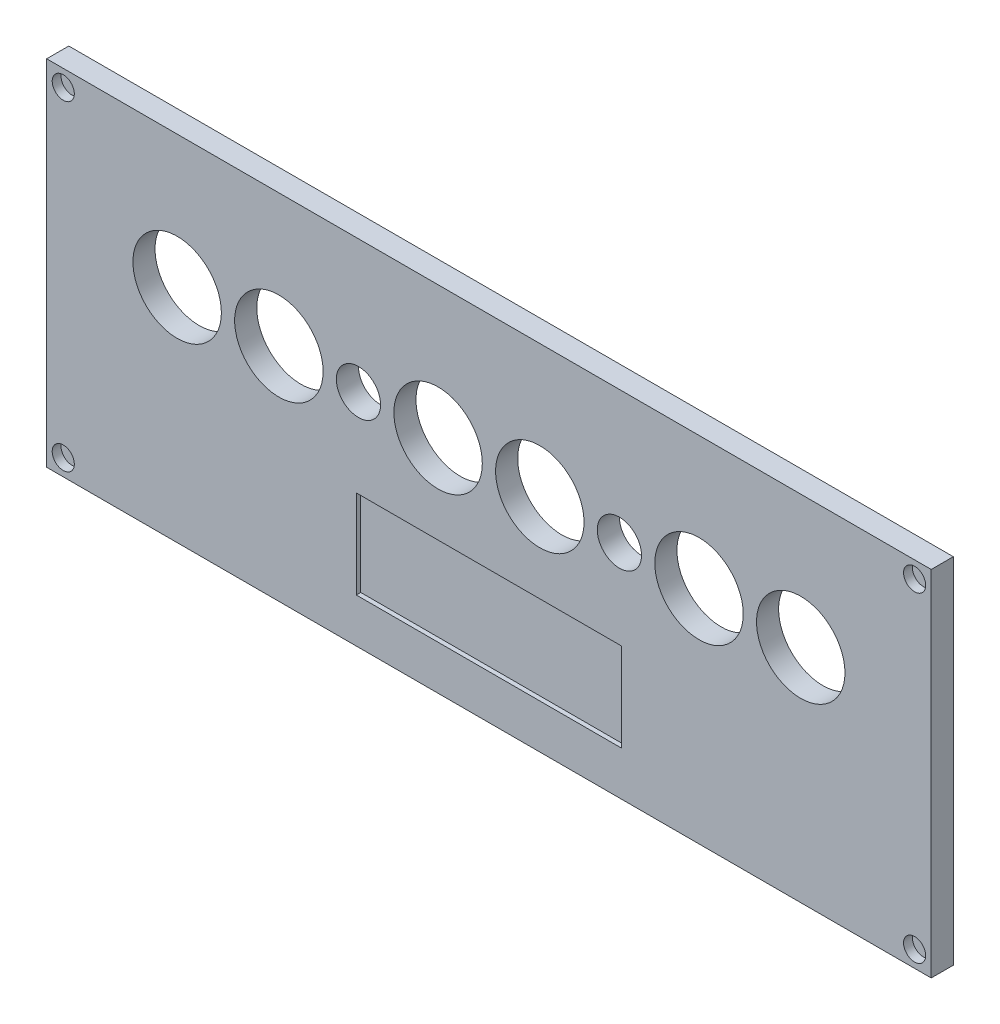
ISO-10303-21;
HEADER;
FILE_DESCRIPTION(('STEP AP214'),'2;1');
FILE_NAME('part.step','',(''),(''),'','','');
FILE_SCHEMA(('AUTOMOTIVE_DESIGN { 1 0 10303 214 1 1 1 1 }'));
ENDSEC;
DATA;
#1=APPLICATION_CONTEXT('core data for automotive mechanical design processes');
#2=APPLICATION_PROTOCOL_DEFINITION('international standard','automotive_design',2000,#1);
#3=PRODUCT_CONTEXT('',#1,'mechanical');
#4=PRODUCT('Part','Part','',(#3));
#5=PRODUCT_RELATED_PRODUCT_CATEGORY('part','',(#4));
#6=PRODUCT_DEFINITION_FORMATION('','',#4);
#7=PRODUCT_DEFINITION_CONTEXT('part definition',#1,'design');
#8=PRODUCT_DEFINITION('design','',#6,#7);
#9=PRODUCT_DEFINITION_SHAPE('','',#8);
#10=(LENGTH_UNIT() NAMED_UNIT(*) SI_UNIT(.MILLI.,.METRE.));
#11=(NAMED_UNIT(*) PLANE_ANGLE_UNIT() SI_UNIT($,.RADIAN.));
#12=(NAMED_UNIT(*) SI_UNIT($,.STERADIAN.) SOLID_ANGLE_UNIT());
#13=UNCERTAINTY_MEASURE_WITH_UNIT(LENGTH_MEASURE(1.E-05),#10,'distance_accuracy_value','');
#14=(GEOMETRIC_REPRESENTATION_CONTEXT(3) GLOBAL_UNCERTAINTY_ASSIGNED_CONTEXT((#13)) GLOBAL_UNIT_ASSIGNED_CONTEXT((#10,
#11,#12)) REPRESENTATION_CONTEXT('',''));
#15=CARTESIAN_POINT('',(0.,0.,0.));
#16=DIRECTION('',(0.,0.,1.));
#17=DIRECTION('',(1.,0.,0.));
#18=AXIS2_PLACEMENT_3D('',#15,#16,#17);
#19=CARTESIAN_POINT('',(100.,-40.,5.));
#20=DIRECTION('',(-1.,0.,0.));
#21=DIRECTION('',(0.,0.,1.));
#22=AXIS2_PLACEMENT_3D('',#19,#20,#21);
#23=PLANE('',#22);
#24=DIRECTION('',(0.,1.,0.));
#25=VECTOR('',#24,1.);
#26=CARTESIAN_POINT('',(100.,-40.,0.));
#27=LINE('',#26,#25);
#28=CARTESIAN_POINT('',(100.,-40.,0.));
#29=VERTEX_POINT('',#28);
#30=CARTESIAN_POINT('',(100.,40.,0.));
#31=VERTEX_POINT('',#30);
#32=EDGE_CURVE('E170',#29,#31,#27,.T.);
#33=ORIENTED_EDGE('',*,*,#32,.T.);
#34=DIRECTION('',(0.,0.,-1.));
#35=VECTOR('',#34,1.);
#36=CARTESIAN_POINT('',(100.,40.,5.));
#37=LINE('',#36,#35);
#38=CARTESIAN_POINT('',(100.,40.,5.));
#39=VERTEX_POINT('',#38);
#40=EDGE_CURVE('E11',#39,#31,#37,.T.);
#41=ORIENTED_EDGE('',*,*,#40,.F.);
#42=DIRECTION('',(0.,1.,0.));
#43=VECTOR('',#42,1.);
#44=CARTESIAN_POINT('',(100.,-40.,5.));
#45=LINE('',#44,#43);
#46=CARTESIAN_POINT('',(100.,-40.,5.));
#47=VERTEX_POINT('',#46);
#48=EDGE_CURVE('E173',#47,#39,#45,.T.);
#49=ORIENTED_EDGE('',*,*,#48,.F.);
#50=DIRECTION('',(0.,0.,-1.));
#51=VECTOR('',#50,1.);
#52=CARTESIAN_POINT('',(100.,-40.,5.));
#53=LINE('',#52,#51);
#54=EDGE_CURVE('E179',#47,#29,#53,.T.);
#55=ORIENTED_EDGE('',*,*,#54,.T.);
#56=EDGE_LOOP('',(#33,#41,#49,#55));
#57=FACE_BOUND('',#56,.T.);
#58=ADVANCED_FACE('F33',(#57),#23,.F.);
#59=CARTESIAN_POINT('',(-100.,40.,5.));
#60=DIRECTION('',(0.,-1.,0.));
#61=DIRECTION('',(0.,0.,-1.));
#62=AXIS2_PLACEMENT_3D('',#59,#60,#61);
#63=PLANE('',#62);
#64=DIRECTION('',(-1.,0.,0.));
#65=VECTOR('',#64,1.);
#66=CARTESIAN_POINT('',(-100.,40.,0.));
#67=LINE('',#66,#65);
#68=CARTESIAN_POINT('',(-100.,40.,0.));
#69=VERTEX_POINT('',#68);
#70=EDGE_CURVE('E182',#31,#69,#67,.T.);
#71=ORIENTED_EDGE('',*,*,#70,.T.);
#72=DIRECTION('',(0.,0.,-1.));
#73=VECTOR('',#72,1.);
#74=CARTESIAN_POINT('',(-100.,40.,5.));
#75=LINE('',#74,#73);
#76=CARTESIAN_POINT('',(-100.,40.,5.));
#77=VERTEX_POINT('',#76);
#78=EDGE_CURVE('E40',#77,#69,#75,.T.);
#79=ORIENTED_EDGE('',*,*,#78,.F.);
#80=DIRECTION('',(-1.,0.,0.));
#81=VECTOR('',#80,1.);
#82=CARTESIAN_POINT('',(-100.,40.,5.));
#83=LINE('',#82,#81);
#84=EDGE_CURVE('E84',#39,#77,#83,.T.);
#85=ORIENTED_EDGE('',*,*,#84,.F.);
#86=ORIENTED_EDGE('',*,*,#40,.T.);
#87=EDGE_LOOP('',(#71,#79,#85,#86));
#88=FACE_BOUND('',#87,.T.);
#89=ADVANCED_FACE('F211',(#88),#63,.F.);
#90=CARTESIAN_POINT('',(-100.,-40.,5.));
#91=DIRECTION('',(1.,0.,0.));
#92=DIRECTION('',(0.,0.,-1.));
#93=AXIS2_PLACEMENT_3D('',#90,#91,#92);
#94=PLANE('',#93);
#95=DIRECTION('',(0.,-1.,0.));
#96=VECTOR('',#95,1.);
#97=CARTESIAN_POINT('',(-100.,-40.,0.));
#98=LINE('',#97,#96);
#99=CARTESIAN_POINT('',(-100.,-40.,0.));
#100=VERTEX_POINT('',#99);
#101=EDGE_CURVE('E184',#69,#100,#98,.T.);
#102=ORIENTED_EDGE('',*,*,#101,.T.);
#103=DIRECTION('',(0.,0.,-1.));
#104=VECTOR('',#103,1.);
#105=CARTESIAN_POINT('',(-100.,-40.,5.));
#106=LINE('',#105,#104);
#107=CARTESIAN_POINT('',(-100.,-40.,5.));
#108=VERTEX_POINT('',#107);
#109=EDGE_CURVE('E188',#108,#100,#106,.T.);
#110=ORIENTED_EDGE('',*,*,#109,.F.);
#111=DIRECTION('',(0.,-1.,0.));
#112=VECTOR('',#111,1.);
#113=CARTESIAN_POINT('',(-100.,-40.,5.));
#114=LINE('',#113,#112);
#115=EDGE_CURVE('E176',#77,#108,#114,.T.);
#116=ORIENTED_EDGE('',*,*,#115,.F.);
#117=ORIENTED_EDGE('',*,*,#78,.T.);
#118=EDGE_LOOP('',(#102,#110,#116,#117));
#119=FACE_BOUND('',#118,.T.);
#120=ADVANCED_FACE('F193',(#119),#94,.F.);
#121=CARTESIAN_POINT('',(-100.,-40.,5.));
#122=DIRECTION('',(0.,1.,0.));
#123=DIRECTION('',(0.,0.,1.));
#124=AXIS2_PLACEMENT_3D('',#121,#122,#123);
#125=PLANE('',#124);
#126=DIRECTION('',(1.,0.,0.));
#127=VECTOR('',#126,1.);
#128=CARTESIAN_POINT('',(-100.,-40.,0.));
#129=LINE('',#128,#127);
#130=EDGE_CURVE('E77',#100,#29,#129,.T.);
#131=ORIENTED_EDGE('',*,*,#130,.T.);
#132=ORIENTED_EDGE('',*,*,#54,.F.);
#133=DIRECTION('',(1.,0.,0.));
#134=VECTOR('',#133,1.);
#135=CARTESIAN_POINT('',(-100.,-40.,5.));
#136=LINE('',#135,#134);
#137=EDGE_CURVE('E56',#108,#47,#136,.T.);
#138=ORIENTED_EDGE('',*,*,#137,.F.);
#139=ORIENTED_EDGE('',*,*,#109,.T.);
#140=EDGE_LOOP('',(#131,#132,#138,#139));
#141=FACE_BOUND('',#140,.T.);
#142=ADVANCED_FACE('F201',(#141),#125,.F.);
#143=CARTESIAN_POINT('',(0.,0.,5.));
#144=DIRECTION('',(0.,0.,-1.));
#145=DIRECTION('',(-1.,0.,0.));
#146=AXIS2_PLACEMENT_3D('',#143,#144,#145);
#147=PLANE('',#146);
#148=CARTESIAN_POINT('',(70.5,10.,5.));
#149=DIRECTION('',(0.,0.,1.));
#150=DIRECTION('',(1.,0.,0.));
#151=AXIS2_PLACEMENT_3D('',#148,#149,#150);
#152=CIRCLE('',#151,9.99999999999998);
#153=CARTESIAN_POINT('',(80.5,10.,5.));
#154=VERTEX_POINT('',#153);
#155=EDGE_CURVE('E456',#154,#154,#152,.T.);
#156=ORIENTED_EDGE('',*,*,#155,.F.);
#157=EDGE_LOOP('',(#156));
#158=FACE_BOUND('',#157,.T.);
#159=CARTESIAN_POINT('',(47.5,10.,5.));
#160=DIRECTION('',(0.,0.,1.));
#161=DIRECTION('',(1.,0.,0.));
#162=AXIS2_PLACEMENT_3D('',#159,#160,#161);
#163=CIRCLE('',#162,9.99999999999999);
#164=CARTESIAN_POINT('',(57.5,10.,5.));
#165=VERTEX_POINT('',#164);
#166=EDGE_CURVE('E458',#165,#165,#163,.T.);
#167=ORIENTED_EDGE('',*,*,#166,.F.);
#168=EDGE_LOOP('',(#167));
#169=FACE_BOUND('',#168,.T.);
#170=CARTESIAN_POINT('',(29.5,10.,5.));
#171=DIRECTION('',(0.,0.,1.));
#172=DIRECTION('',(1.,0.,0.));
#173=AXIS2_PLACEMENT_3D('',#170,#171,#172);
#174=CIRCLE('',#173,5.);
#175=CARTESIAN_POINT('',(34.5,10.,5.));
#176=VERTEX_POINT('',#175);
#177=EDGE_CURVE('E464',#176,#176,#174,.T.);
#178=ORIENTED_EDGE('',*,*,#177,.F.);
#179=EDGE_LOOP('',(#178));
#180=FACE_BOUND('',#179,.T.);
#181=CARTESIAN_POINT('',(11.5,10.,5.));
#182=DIRECTION('',(0.,0.,1.));
#183=DIRECTION('',(1.,0.,0.));
#184=AXIS2_PLACEMENT_3D('',#181,#182,#183);
#185=CIRCLE('',#184,10.);
#186=CARTESIAN_POINT('',(21.5,10.,5.));
#187=VERTEX_POINT('',#186);
#188=EDGE_CURVE('E470',#187,#187,#185,.T.);
#189=ORIENTED_EDGE('',*,*,#188,.F.);
#190=EDGE_LOOP('',(#189));
#191=FACE_BOUND('',#190,.T.);
#192=CARTESIAN_POINT('',(-11.5,10.,5.));
#193=DIRECTION('',(0.,0.,1.));
#194=DIRECTION('',(1.,0.,0.));
#195=AXIS2_PLACEMENT_3D('',#192,#193,#194);
#196=CIRCLE('',#195,10.);
#197=CARTESIAN_POINT('',(-1.50000000000002,10.,5.));
#198=VERTEX_POINT('',#197);
#199=EDGE_CURVE('E476',#198,#198,#196,.T.);
#200=ORIENTED_EDGE('',*,*,#199,.F.);
#201=EDGE_LOOP('',(#200));
#202=FACE_BOUND('',#201,.T.);
#203=CARTESIAN_POINT('',(-29.5,10.,5.));
#204=DIRECTION('',(0.,0.,1.));
#205=DIRECTION('',(1.,0.,0.));
#206=AXIS2_PLACEMENT_3D('',#203,#204,#205);
#207=CIRCLE('',#206,5.);
#208=CARTESIAN_POINT('',(-24.5,10.,5.));
#209=VERTEX_POINT('',#208);
#210=EDGE_CURVE('E482',#209,#209,#207,.T.);
#211=ORIENTED_EDGE('',*,*,#210,.F.);
#212=EDGE_LOOP('',(#211));
#213=FACE_BOUND('',#212,.T.);
#214=CARTESIAN_POINT('',(-47.5,10.,5.));
#215=DIRECTION('',(0.,0.,1.));
#216=DIRECTION('',(1.,0.,0.));
#217=AXIS2_PLACEMENT_3D('',#214,#215,#216);
#218=CIRCLE('',#217,10.);
#219=CARTESIAN_POINT('',(-37.5,10.,5.));
#220=VERTEX_POINT('',#219);
#221=EDGE_CURVE('E488',#220,#220,#218,.T.);
#222=ORIENTED_EDGE('',*,*,#221,.F.);
#223=EDGE_LOOP('',(#222));
#224=FACE_BOUND('',#223,.T.);
#225=CARTESIAN_POINT('',(-70.5,10.,5.));
#226=DIRECTION('',(0.,0.,1.));
#227=DIRECTION('',(1.,0.,0.));
#228=AXIS2_PLACEMENT_3D('',#225,#226,#227);
#229=CIRCLE('',#228,9.99999999999999);
#230=CARTESIAN_POINT('',(-60.5,10.,5.));
#231=VERTEX_POINT('',#230);
#232=EDGE_CURVE('E132',#231,#231,#229,.T.);
#233=ORIENTED_EDGE('',*,*,#232,.F.);
#234=EDGE_LOOP('',(#233));
#235=FACE_BOUND('',#234,.T.);
#236=DIRECTION('',(-1.,0.,0.));
#237=VECTOR('',#236,1.);
#238=CARTESIAN_POINT('',(-30.,-10.,5.));
#239=LINE('',#238,#237);
#240=CARTESIAN_POINT('',(30.,-10.,5.));
#241=VERTEX_POINT('',#240);
#242=CARTESIAN_POINT('',(-30.,-10.,5.));
#243=VERTEX_POINT('',#242);
#244=EDGE_CURVE('E138',#241,#243,#239,.T.);
#245=ORIENTED_EDGE('',*,*,#244,.F.);
#246=DIRECTION('',(0.,1.,0.));
#247=VECTOR('',#246,1.);
#248=CARTESIAN_POINT('',(30.,-30.,5.));
#249=LINE('',#248,#247);
#250=CARTESIAN_POINT('',(30.,-30.,5.));
#251=VERTEX_POINT('',#250);
#252=EDGE_CURVE('E47',#251,#241,#249,.T.);
#253=ORIENTED_EDGE('',*,*,#252,.F.);
#254=DIRECTION('',(1.,0.,0.));
#255=VECTOR('',#254,1.);
#256=CARTESIAN_POINT('',(-30.,-30.,5.));
#257=LINE('',#256,#255);
#258=CARTESIAN_POINT('',(-30.,-30.,5.));
#259=VERTEX_POINT('',#258);
#260=EDGE_CURVE('E126',#259,#251,#257,.T.);
#261=ORIENTED_EDGE('',*,*,#260,.F.);
#262=DIRECTION('',(0.,-1.,0.));
#263=VECTOR('',#262,1.);
#264=CARTESIAN_POINT('',(-30.,-30.,5.));
#265=LINE('',#264,#263);
#266=EDGE_CURVE('E129',#243,#259,#265,.T.);
#267=ORIENTED_EDGE('',*,*,#266,.F.);
#268=EDGE_LOOP('',(#245,#253,#261,#267));
#269=FACE_BOUND('',#268,.T.);
#270=CARTESIAN_POINT('',(96.25,36.2500000000027,5.));
#271=DIRECTION('',(0.,0.,1.));
#272=DIRECTION('',(1.,0.,0.));
#273=AXIS2_PLACEMENT_3D('',#270,#271,#272);
#274=CIRCLE('',#273,2.5);
#275=CARTESIAN_POINT('',(98.75,36.2500000000027,5.));
#276=VERTEX_POINT('',#275);
#277=EDGE_CURVE('E149',#276,#276,#274,.T.);
#278=ORIENTED_EDGE('',*,*,#277,.F.);
#279=EDGE_LOOP('',(#278));
#280=FACE_BOUND('',#279,.T.);
#281=CARTESIAN_POINT('',(96.2500000000008,-36.2499999999973,5.));
#282=DIRECTION('',(0.,0.,1.));
#283=DIRECTION('',(1.,0.,0.));
#284=AXIS2_PLACEMENT_3D('',#281,#282,#283);
#285=CIRCLE('',#284,2.5);
#286=CARTESIAN_POINT('',(98.7500000000008,-36.2499999999973,5.));
#287=VERTEX_POINT('',#286);
#288=EDGE_CURVE('E155',#287,#287,#285,.T.);
#289=ORIENTED_EDGE('',*,*,#288,.F.);
#290=EDGE_LOOP('',(#289));
#291=FACE_BOUND('',#290,.T.);
#292=CARTESIAN_POINT('',(-96.2499999999992,-36.25,5.));
#293=DIRECTION('',(0.,0.,1.));
#294=DIRECTION('',(1.,0.,0.));
#295=AXIS2_PLACEMENT_3D('',#292,#293,#294);
#296=CIRCLE('',#295,2.5);
#297=CARTESIAN_POINT('',(-93.7499999999992,-36.25,5.));
#298=VERTEX_POINT('',#297);
#299=EDGE_CURVE('E161',#298,#298,#296,.T.);
#300=ORIENTED_EDGE('',*,*,#299,.F.);
#301=EDGE_LOOP('',(#300));
#302=FACE_BOUND('',#301,.T.);
#303=CARTESIAN_POINT('',(-96.25,36.25,5.));
#304=DIRECTION('',(0.,0.,1.));
#305=DIRECTION('',(1.,0.,0.));
#306=AXIS2_PLACEMENT_3D('',#303,#304,#305);
#307=CIRCLE('',#306,2.5);
#308=CARTESIAN_POINT('',(-93.75,36.25,5.));
#309=VERTEX_POINT('',#308);
#310=EDGE_CURVE('E164',#309,#309,#307,.T.);
#311=ORIENTED_EDGE('',*,*,#310,.F.);
#312=EDGE_LOOP('',(#311));
#313=FACE_BOUND('',#312,.T.);
#314=ORIENTED_EDGE('',*,*,#48,.T.);
#315=ORIENTED_EDGE('',*,*,#84,.T.);
#316=ORIENTED_EDGE('',*,*,#115,.T.);
#317=ORIENTED_EDGE('',*,*,#137,.T.);
#318=EDGE_LOOP('',(#314,#315,#316,#317));
#319=FACE_BOUND('',#318,.T.);
#320=ADVANCED_FACE('F203',(#158,#169,#180,#191,#202,#213,#224,#235,#269,#280,#291,#302,#313,
#319),#147,.F.);
#321=CARTESIAN_POINT('',(0.,0.,0.));
#322=DIRECTION('',(0.,0.,-1.));
#323=DIRECTION('',(-1.,0.,0.));
#324=AXIS2_PLACEMENT_3D('',#321,#322,#323);
#325=PLANE('',#324);
#326=CARTESIAN_POINT('',(70.5,10.,0.));
#327=DIRECTION('',(0.,0.,1.));
#328=DIRECTION('',(1.,0.,0.));
#329=AXIS2_PLACEMENT_3D('',#326,#327,#328);
#330=CIRCLE('',#329,9.99999999999998);
#331=CARTESIAN_POINT('',(80.5,10.,0.));
#332=VERTEX_POINT('',#331);
#333=EDGE_CURVE('E453',#332,#332,#330,.T.);
#334=ORIENTED_EDGE('',*,*,#333,.T.);
#335=EDGE_LOOP('',(#334));
#336=FACE_BOUND('',#335,.T.);
#337=CARTESIAN_POINT('',(47.5,10.,0.));
#338=DIRECTION('',(0.,0.,1.));
#339=DIRECTION('',(1.,0.,0.));
#340=AXIS2_PLACEMENT_3D('',#337,#338,#339);
#341=CIRCLE('',#340,9.99999999999999);
#342=CARTESIAN_POINT('',(57.5,10.,0.));
#343=VERTEX_POINT('',#342);
#344=EDGE_CURVE('E461',#343,#343,#341,.T.);
#345=ORIENTED_EDGE('',*,*,#344,.T.);
#346=EDGE_LOOP('',(#345));
#347=FACE_BOUND('',#346,.T.);
#348=CARTESIAN_POINT('',(29.5,10.,0.));
#349=DIRECTION('',(0.,0.,1.));
#350=DIRECTION('',(1.,0.,0.));
#351=AXIS2_PLACEMENT_3D('',#348,#349,#350);
#352=CIRCLE('',#351,5.);
#353=CARTESIAN_POINT('',(34.5,10.,0.));
#354=VERTEX_POINT('',#353);
#355=EDGE_CURVE('E467',#354,#354,#352,.T.);
#356=ORIENTED_EDGE('',*,*,#355,.T.);
#357=EDGE_LOOP('',(#356));
#358=FACE_BOUND('',#357,.T.);
#359=CARTESIAN_POINT('',(11.5,10.,0.));
#360=DIRECTION('',(0.,0.,1.));
#361=DIRECTION('',(1.,0.,0.));
#362=AXIS2_PLACEMENT_3D('',#359,#360,#361);
#363=CIRCLE('',#362,10.);
#364=CARTESIAN_POINT('',(21.5,10.,0.));
#365=VERTEX_POINT('',#364);
#366=EDGE_CURVE('E473',#365,#365,#363,.T.);
#367=ORIENTED_EDGE('',*,*,#366,.T.);
#368=EDGE_LOOP('',(#367));
#369=FACE_BOUND('',#368,.T.);
#370=CARTESIAN_POINT('',(-11.5,10.,0.));
#371=DIRECTION('',(0.,0.,1.));
#372=DIRECTION('',(1.,0.,0.));
#373=AXIS2_PLACEMENT_3D('',#370,#371,#372);
#374=CIRCLE('',#373,10.);
#375=CARTESIAN_POINT('',(-1.50000000000002,10.,0.));
#376=VERTEX_POINT('',#375);
#377=EDGE_CURVE('E479',#376,#376,#374,.T.);
#378=ORIENTED_EDGE('',*,*,#377,.T.);
#379=EDGE_LOOP('',(#378));
#380=FACE_BOUND('',#379,.T.);
#381=CARTESIAN_POINT('',(-29.5,10.,0.));
#382=DIRECTION('',(0.,0.,1.));
#383=DIRECTION('',(1.,0.,0.));
#384=AXIS2_PLACEMENT_3D('',#381,#382,#383);
#385=CIRCLE('',#384,5.);
#386=CARTESIAN_POINT('',(-24.5,10.,0.));
#387=VERTEX_POINT('',#386);
#388=EDGE_CURVE('E485',#387,#387,#385,.T.);
#389=ORIENTED_EDGE('',*,*,#388,.T.);
#390=EDGE_LOOP('',(#389));
#391=FACE_BOUND('',#390,.T.);
#392=CARTESIAN_POINT('',(-47.5,10.,0.));
#393=DIRECTION('',(0.,0.,1.));
#394=DIRECTION('',(1.,0.,0.));
#395=AXIS2_PLACEMENT_3D('',#392,#393,#394);
#396=CIRCLE('',#395,10.);
#397=CARTESIAN_POINT('',(-37.5,10.,0.));
#398=VERTEX_POINT('',#397);
#399=EDGE_CURVE('E491',#398,#398,#396,.T.);
#400=ORIENTED_EDGE('',*,*,#399,.T.);
#401=EDGE_LOOP('',(#400));
#402=FACE_BOUND('',#401,.T.);
#403=CARTESIAN_POINT('',(-70.5,10.,0.));
#404=DIRECTION('',(0.,0.,1.));
#405=DIRECTION('',(1.,0.,0.));
#406=AXIS2_PLACEMENT_3D('',#403,#404,#405);
#407=CIRCLE('',#406,9.99999999999999);
#408=CARTESIAN_POINT('',(-60.5,10.,0.));
#409=VERTEX_POINT('',#408);
#410=EDGE_CURVE('E139',#409,#409,#407,.T.);
#411=ORIENTED_EDGE('',*,*,#410,.T.);
#412=EDGE_LOOP('',(#411));
#413=FACE_BOUND('',#412,.T.);
#414=ORIENTED_EDGE('',*,*,#32,.F.);
#415=ORIENTED_EDGE('',*,*,#130,.F.);
#416=ORIENTED_EDGE('',*,*,#101,.F.);
#417=ORIENTED_EDGE('',*,*,#70,.F.);
#418=EDGE_LOOP('',(#414,#415,#416,#417));
#419=FACE_BOUND('',#418,.T.);
#420=ADVANCED_FACE('F197',(#336,#347,#358,#369,#380,#391,#402,#413,#419),#325,.T.);
#421=CARTESIAN_POINT('',(-96.25,36.25,3.));
#422=DIRECTION('',(0.,0.,1.));
#423=DIRECTION('',(1.,0.,0.));
#424=AXIS2_PLACEMENT_3D('',#421,#422,#423);
#425=CYLINDRICAL_SURFACE('',#424,2.5);
#426=CARTESIAN_POINT('',(-96.25,36.25,3.));
#427=DIRECTION('',(0.,0.,1.));
#428=DIRECTION('',(1.,0.,0.));
#429=AXIS2_PLACEMENT_3D('',#426,#427,#428);
#430=CIRCLE('',#429,2.5);
#431=CARTESIAN_POINT('',(-93.75,36.25,3.));
#432=VERTEX_POINT('',#431);
#433=EDGE_CURVE('E167',#432,#432,#430,.T.);
#434=ORIENTED_EDGE('',*,*,#433,.F.);
#435=EDGE_LOOP('',(#434));
#436=FACE_BOUND('',#435,.T.);
#437=ORIENTED_EDGE('',*,*,#310,.T.);
#438=EDGE_LOOP('',(#437));
#439=FACE_BOUND('',#438,.T.);
#440=ADVANCED_FACE('F234',(#436,#439),#425,.F.);
#441=CARTESIAN_POINT('',(-96.25,36.25,3.));
#442=DIRECTION('',(0.,0.,1.));
#443=DIRECTION('',(1.,0.,0.));
#444=AXIS2_PLACEMENT_3D('',#441,#442,#443);
#445=PLANE('',#444);
#446=ORIENTED_EDGE('',*,*,#433,.T.);
#447=EDGE_LOOP('',(#446));
#448=FACE_BOUND('',#447,.T.);
#449=ADVANCED_FACE('F239',(#448),#445,.T.);
#450=CARTESIAN_POINT('',(-96.2499999999992,-36.25,3.));
#451=DIRECTION('',(0.,0.,1.));
#452=DIRECTION('',(1.,0.,0.));
#453=AXIS2_PLACEMENT_3D('',#450,#451,#452);
#454=CYLINDRICAL_SURFACE('',#453,2.5);
#455=CARTESIAN_POINT('',(-96.2499999999992,-36.25,3.));
#456=DIRECTION('',(0.,0.,1.));
#457=DIRECTION('',(1.,0.,0.));
#458=AXIS2_PLACEMENT_3D('',#455,#456,#457);
#459=CIRCLE('',#458,2.5);
#460=CARTESIAN_POINT('',(-93.7499999999992,-36.25,3.));
#461=VERTEX_POINT('',#460);
#462=EDGE_CURVE('E158',#461,#461,#459,.T.);
#463=ORIENTED_EDGE('',*,*,#462,.F.);
#464=EDGE_LOOP('',(#463));
#465=FACE_BOUND('',#464,.T.);
#466=ORIENTED_EDGE('',*,*,#299,.T.);
#467=EDGE_LOOP('',(#466));
#468=FACE_BOUND('',#467,.T.);
#469=ADVANCED_FACE('F251',(#465,#468),#454,.F.);
#470=CARTESIAN_POINT('',(-96.2499999999992,-36.25,3.));
#471=DIRECTION('',(0.,0.,1.));
#472=DIRECTION('',(1.,0.,0.));
#473=AXIS2_PLACEMENT_3D('',#470,#471,#472);
#474=PLANE('',#473);
#475=ORIENTED_EDGE('',*,*,#462,.T.);
#476=EDGE_LOOP('',(#475));
#477=FACE_BOUND('',#476,.T.);
#478=ADVANCED_FACE('F261',(#477),#474,.T.);
#479=CARTESIAN_POINT('',(96.2500000000008,-36.2499999999973,3.));
#480=DIRECTION('',(0.,0.,1.));
#481=DIRECTION('',(1.,0.,0.));
#482=AXIS2_PLACEMENT_3D('',#479,#480,#481);
#483=CYLINDRICAL_SURFACE('',#482,2.5);
#484=CARTESIAN_POINT('',(96.2500000000008,-36.2499999999973,3.));
#485=DIRECTION('',(0.,0.,1.));
#486=DIRECTION('',(1.,0.,0.));
#487=AXIS2_PLACEMENT_3D('',#484,#485,#486);
#488=CIRCLE('',#487,2.5);
#489=CARTESIAN_POINT('',(98.7500000000008,-36.2499999999973,3.));
#490=VERTEX_POINT('',#489);
#491=EDGE_CURVE('E152',#490,#490,#488,.T.);
#492=ORIENTED_EDGE('',*,*,#491,.F.);
#493=EDGE_LOOP('',(#492));
#494=FACE_BOUND('',#493,.T.);
#495=ORIENTED_EDGE('',*,*,#288,.T.);
#496=EDGE_LOOP('',(#495));
#497=FACE_BOUND('',#496,.T.);
#498=ADVANCED_FACE('F271',(#494,#497),#483,.F.);
#499=CARTESIAN_POINT('',(96.2500000000008,-36.2499999999973,3.));
#500=DIRECTION('',(0.,0.,1.));
#501=DIRECTION('',(1.,0.,0.));
#502=AXIS2_PLACEMENT_3D('',#499,#500,#501);
#503=PLANE('',#502);
#504=ORIENTED_EDGE('',*,*,#491,.T.);
#505=EDGE_LOOP('',(#504));
#506=FACE_BOUND('',#505,.T.);
#507=ADVANCED_FACE('F281',(#506),#503,.T.);
#508=CARTESIAN_POINT('',(96.25,36.2500000000027,3.));
#509=DIRECTION('',(0.,0.,1.));
#510=DIRECTION('',(1.,0.,0.));
#511=AXIS2_PLACEMENT_3D('',#508,#509,#510);
#512=CYLINDRICAL_SURFACE('',#511,2.5);
#513=CARTESIAN_POINT('',(96.25,36.2500000000027,3.));
#514=DIRECTION('',(0.,0.,1.));
#515=DIRECTION('',(1.,0.,0.));
#516=AXIS2_PLACEMENT_3D('',#513,#514,#515);
#517=CIRCLE('',#516,2.5);
#518=CARTESIAN_POINT('',(98.75,36.2500000000027,3.));
#519=VERTEX_POINT('',#518);
#520=EDGE_CURVE('E145',#519,#519,#517,.T.);
#521=ORIENTED_EDGE('',*,*,#520,.F.);
#522=EDGE_LOOP('',(#521));
#523=FACE_BOUND('',#522,.T.);
#524=ORIENTED_EDGE('',*,*,#277,.T.);
#525=EDGE_LOOP('',(#524));
#526=FACE_BOUND('',#525,.T.);
#527=ADVANCED_FACE('F291',(#523,#526),#512,.F.);
#528=CARTESIAN_POINT('',(96.25,36.2500000000027,3.));
#529=DIRECTION('',(0.,0.,1.));
#530=DIRECTION('',(1.,0.,0.));
#531=AXIS2_PLACEMENT_3D('',#528,#529,#530);
#532=PLANE('',#531);
#533=ORIENTED_EDGE('',*,*,#520,.T.);
#534=EDGE_LOOP('',(#533));
#535=FACE_BOUND('',#534,.T.);
#536=ADVANCED_FACE('F301',(#535),#532,.T.);
#537=CARTESIAN_POINT('',(30.,-30.,4.));
#538=DIRECTION('',(1.,0.,0.));
#539=DIRECTION('',(0.,0.,-1.));
#540=AXIS2_PLACEMENT_3D('',#537,#538,#539);
#541=PLANE('',#540);
#542=ORIENTED_EDGE('',*,*,#252,.T.);
#543=DIRECTION('',(0.,0.,1.));
#544=VECTOR('',#543,1.);
#545=CARTESIAN_POINT('',(30.,-10.,4.));
#546=LINE('',#545,#544);
#547=CARTESIAN_POINT('',(30.,-10.,4.));
#548=VERTEX_POINT('',#547);
#549=EDGE_CURVE('E104',#548,#241,#546,.T.);
#550=ORIENTED_EDGE('',*,*,#549,.F.);
#551=DIRECTION('',(0.,1.,0.));
#552=VECTOR('',#551,1.);
#553=CARTESIAN_POINT('',(30.,-30.,4.));
#554=LINE('',#553,#552);
#555=CARTESIAN_POINT('',(30.,-30.,4.));
#556=VERTEX_POINT('',#555);
#557=EDGE_CURVE('E108',#556,#548,#554,.T.);
#558=ORIENTED_EDGE('',*,*,#557,.F.);
#559=DIRECTION('',(0.,0.,1.));
#560=VECTOR('',#559,1.);
#561=CARTESIAN_POINT('',(30.,-30.,4.));
#562=LINE('',#561,#560);
#563=EDGE_CURVE('E143',#556,#251,#562,.T.);
#564=ORIENTED_EDGE('',*,*,#563,.T.);
#565=EDGE_LOOP('',(#542,#550,#558,#564));
#566=FACE_BOUND('',#565,.T.);
#567=ADVANCED_FACE('F106',(#566),#541,.F.);
#568=CARTESIAN_POINT('',(-30.,-30.,4.));
#569=DIRECTION('',(0.,-1.,0.));
#570=DIRECTION('',(0.,0.,-1.));
#571=AXIS2_PLACEMENT_3D('',#568,#569,#570);
#572=PLANE('',#571);
#573=ORIENTED_EDGE('',*,*,#260,.T.);
#574=ORIENTED_EDGE('',*,*,#563,.F.);
#575=DIRECTION('',(1.,0.,0.));
#576=VECTOR('',#575,1.);
#577=CARTESIAN_POINT('',(-30.,-30.,4.));
#578=LINE('',#577,#576);
#579=CARTESIAN_POINT('',(-30.,-30.,4.));
#580=VERTEX_POINT('',#579);
#581=EDGE_CURVE('E114',#580,#556,#578,.T.);
#582=ORIENTED_EDGE('',*,*,#581,.F.);
#583=DIRECTION('',(0.,0.,1.));
#584=VECTOR('',#583,1.);
#585=CARTESIAN_POINT('',(-30.,-30.,4.));
#586=LINE('',#585,#584);
#587=EDGE_CURVE('E146',#580,#259,#586,.T.);
#588=ORIENTED_EDGE('',*,*,#587,.T.);
#589=EDGE_LOOP('',(#573,#574,#582,#588));
#590=FACE_BOUND('',#589,.T.);
#591=ADVANCED_FACE('F320',(#590),#572,.F.);
#592=CARTESIAN_POINT('',(-30.,-30.,4.));
#593=DIRECTION('',(-1.,0.,0.));
#594=DIRECTION('',(0.,0.,1.));
#595=AXIS2_PLACEMENT_3D('',#592,#593,#594);
#596=PLANE('',#595);
#597=ORIENTED_EDGE('',*,*,#266,.T.);
#598=ORIENTED_EDGE('',*,*,#587,.F.);
#599=DIRECTION('',(0.,-1.,0.));
#600=VECTOR('',#599,1.);
#601=CARTESIAN_POINT('',(-30.,-30.,4.));
#602=LINE('',#601,#600);
#603=CARTESIAN_POINT('',(-30.,-10.,4.));
#604=VERTEX_POINT('',#603);
#605=EDGE_CURVE('E122',#604,#580,#602,.T.);
#606=ORIENTED_EDGE('',*,*,#605,.F.);
#607=DIRECTION('',(0.,0.,1.));
#608=VECTOR('',#607,1.);
#609=CARTESIAN_POINT('',(-30.,-10.,4.));
#610=LINE('',#609,#608);
#611=EDGE_CURVE('E113',#604,#243,#610,.T.);
#612=ORIENTED_EDGE('',*,*,#611,.T.);
#613=EDGE_LOOP('',(#597,#598,#606,#612));
#614=FACE_BOUND('',#613,.T.);
#615=ADVANCED_FACE('F329',(#614),#596,.F.);
#616=CARTESIAN_POINT('',(-30.,-10.,4.));
#617=DIRECTION('',(0.,1.,0.));
#618=DIRECTION('',(0.,0.,1.));
#619=AXIS2_PLACEMENT_3D('',#616,#617,#618);
#620=PLANE('',#619);
#621=ORIENTED_EDGE('',*,*,#244,.T.);
#622=ORIENTED_EDGE('',*,*,#611,.F.);
#623=DIRECTION('',(-1.,0.,0.));
#624=VECTOR('',#623,1.);
#625=CARTESIAN_POINT('',(-30.,-10.,4.));
#626=LINE('',#625,#624);
#627=EDGE_CURVE('E117',#548,#604,#626,.T.);
#628=ORIENTED_EDGE('',*,*,#627,.F.);
#629=ORIENTED_EDGE('',*,*,#549,.T.);
#630=EDGE_LOOP('',(#621,#622,#628,#629));
#631=FACE_BOUND('',#630,.T.);
#632=ADVANCED_FACE('F118',(#631),#620,.F.);
#633=CARTESIAN_POINT('',(0.,0.,4.));
#634=DIRECTION('',(0.,0.,-1.));
#635=DIRECTION('',(-1.,0.,0.));
#636=AXIS2_PLACEMENT_3D('',#633,#634,#635);
#637=PLANE('',#636);
#638=ORIENTED_EDGE('',*,*,#557,.T.);
#639=ORIENTED_EDGE('',*,*,#627,.T.);
#640=ORIENTED_EDGE('',*,*,#605,.T.);
#641=ORIENTED_EDGE('',*,*,#581,.T.);
#642=EDGE_LOOP('',(#638,#639,#640,#641));
#643=FACE_BOUND('',#642,.T.);
#644=ADVANCED_FACE('F124',(#643),#637,.F.);
#645=CARTESIAN_POINT('',(-70.5,10.,0.));
#646=DIRECTION('',(0.,0.,1.));
#647=DIRECTION('',(1.,0.,0.));
#648=AXIS2_PLACEMENT_3D('',#645,#646,#647);
#649=CYLINDRICAL_SURFACE('',#648,9.99999999999999);
#650=ORIENTED_EDGE('',*,*,#410,.F.);
#651=EDGE_LOOP('',(#650));
#652=FACE_BOUND('',#651,.T.);
#653=ORIENTED_EDGE('',*,*,#232,.T.);
#654=EDGE_LOOP('',(#653));
#655=FACE_BOUND('',#654,.T.);
#656=ADVANCED_FACE('F356',(#652,#655),#649,.F.);
#657=CARTESIAN_POINT('',(-47.5,10.,0.));
#658=DIRECTION('',(0.,0.,1.));
#659=DIRECTION('',(1.,0.,0.));
#660=AXIS2_PLACEMENT_3D('',#657,#658,#659);
#661=CYLINDRICAL_SURFACE('',#660,10.);
#662=ORIENTED_EDGE('',*,*,#399,.F.);
#663=EDGE_LOOP('',(#662));
#664=FACE_BOUND('',#663,.T.);
#665=ORIENTED_EDGE('',*,*,#221,.T.);
#666=EDGE_LOOP('',(#665));
#667=FACE_BOUND('',#666,.T.);
#668=ADVANCED_FACE('F376',(#664,#667),#661,.F.);
#669=CARTESIAN_POINT('',(-29.5,10.,0.));
#670=DIRECTION('',(0.,0.,1.));
#671=DIRECTION('',(1.,0.,0.));
#672=AXIS2_PLACEMENT_3D('',#669,#670,#671);
#673=CYLINDRICAL_SURFACE('',#672,5.);
#674=ORIENTED_EDGE('',*,*,#388,.F.);
#675=EDGE_LOOP('',(#674));
#676=FACE_BOUND('',#675,.T.);
#677=ORIENTED_EDGE('',*,*,#210,.T.);
#678=EDGE_LOOP('',(#677));
#679=FACE_BOUND('',#678,.T.);
#680=ADVANCED_FACE('F386',(#676,#679),#673,.F.);
#681=CARTESIAN_POINT('',(-11.5,10.,0.));
#682=DIRECTION('',(0.,0.,1.));
#683=DIRECTION('',(1.,0.,0.));
#684=AXIS2_PLACEMENT_3D('',#681,#682,#683);
#685=CYLINDRICAL_SURFACE('',#684,10.);
#686=ORIENTED_EDGE('',*,*,#377,.F.);
#687=EDGE_LOOP('',(#686));
#688=FACE_BOUND('',#687,.T.);
#689=ORIENTED_EDGE('',*,*,#199,.T.);
#690=EDGE_LOOP('',(#689));
#691=FACE_BOUND('',#690,.T.);
#692=ADVANCED_FACE('F396',(#688,#691),#685,.F.);
#693=CARTESIAN_POINT('',(11.5,10.,0.));
#694=DIRECTION('',(0.,0.,1.));
#695=DIRECTION('',(1.,0.,0.));
#696=AXIS2_PLACEMENT_3D('',#693,#694,#695);
#697=CYLINDRICAL_SURFACE('',#696,10.);
#698=ORIENTED_EDGE('',*,*,#366,.F.);
#699=EDGE_LOOP('',(#698));
#700=FACE_BOUND('',#699,.T.);
#701=ORIENTED_EDGE('',*,*,#188,.T.);
#702=EDGE_LOOP('',(#701));
#703=FACE_BOUND('',#702,.T.);
#704=ADVANCED_FACE('F406',(#700,#703),#697,.F.);
#705=CARTESIAN_POINT('',(29.5,10.,0.));
#706=DIRECTION('',(0.,0.,1.));
#707=DIRECTION('',(1.,0.,0.));
#708=AXIS2_PLACEMENT_3D('',#705,#706,#707);
#709=CYLINDRICAL_SURFACE('',#708,5.);
#710=ORIENTED_EDGE('',*,*,#355,.F.);
#711=EDGE_LOOP('',(#710));
#712=FACE_BOUND('',#711,.T.);
#713=ORIENTED_EDGE('',*,*,#177,.T.);
#714=EDGE_LOOP('',(#713));
#715=FACE_BOUND('',#714,.T.);
#716=ADVANCED_FACE('F416',(#712,#715),#709,.F.);
#717=CARTESIAN_POINT('',(47.5,10.,0.));
#718=DIRECTION('',(0.,0.,1.));
#719=DIRECTION('',(1.,0.,0.));
#720=AXIS2_PLACEMENT_3D('',#717,#718,#719);
#721=CYLINDRICAL_SURFACE('',#720,9.99999999999999);
#722=ORIENTED_EDGE('',*,*,#344,.F.);
#723=EDGE_LOOP('',(#722));
#724=FACE_BOUND('',#723,.T.);
#725=ORIENTED_EDGE('',*,*,#166,.T.);
#726=EDGE_LOOP('',(#725));
#727=FACE_BOUND('',#726,.T.);
#728=ADVANCED_FACE('F426',(#724,#727),#721,.F.);
#729=CARTESIAN_POINT('',(70.5,10.,0.));
#730=DIRECTION('',(0.,0.,1.));
#731=DIRECTION('',(1.,0.,0.));
#732=AXIS2_PLACEMENT_3D('',#729,#730,#731);
#733=CYLINDRICAL_SURFACE('',#732,9.99999999999998);
#734=ORIENTED_EDGE('',*,*,#333,.F.);
#735=EDGE_LOOP('',(#734));
#736=FACE_BOUND('',#735,.T.);
#737=ORIENTED_EDGE('',*,*,#155,.T.);
#738=EDGE_LOOP('',(#737));
#739=FACE_BOUND('',#738,.T.);
#740=ADVANCED_FACE('F436',(#736,#739),#733,.F.);
#741=CLOSED_SHELL('',(#58,#89,#120,#142,#320,#420,#440,#449,#469,#478,#498,#507,#527,#536,#567,
#591,#615,#632,#644,#656,#668,#680,#692,#704,#716,#728,#740));
#742=MANIFOLD_SOLID_BREP('B2',#741);
#743=ADVANCED_BREP_SHAPE_REPRESENTATION('',(#18,#742),#14);
#744=SHAPE_DEFINITION_REPRESENTATION(#9,#743);
ENDSEC;
END-ISO-10303-21;
